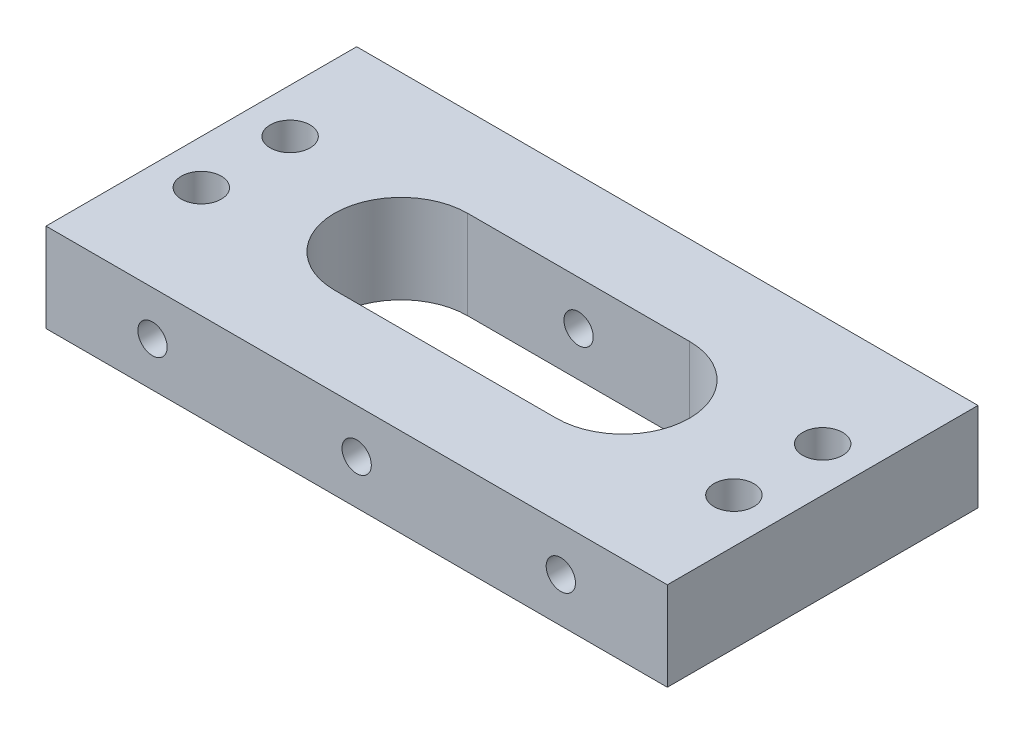
ISO-10303-21;
HEADER;
FILE_DESCRIPTION(('STEP AP214'),'2;1');
FILE_NAME('part.step','',(''),(''),'','','');
FILE_SCHEMA(('AUTOMOTIVE_DESIGN { 1 0 10303 214 1 1 1 1 }'));
ENDSEC;
DATA;
#1=APPLICATION_CONTEXT('core data for automotive mechanical design processes');
#2=APPLICATION_PROTOCOL_DEFINITION('international standard','automotive_design',2000,#1);
#3=PRODUCT_CONTEXT('',#1,'mechanical');
#4=PRODUCT('Part','Part','',(#3));
#5=PRODUCT_RELATED_PRODUCT_CATEGORY('part','',(#4));
#6=PRODUCT_DEFINITION_FORMATION('','',#4);
#7=PRODUCT_DEFINITION_CONTEXT('part definition',#1,'design');
#8=PRODUCT_DEFINITION('design','',#6,#7);
#9=PRODUCT_DEFINITION_SHAPE('','',#8);
#10=(LENGTH_UNIT() NAMED_UNIT(*) SI_UNIT(.MILLI.,.METRE.));
#11=(NAMED_UNIT(*) PLANE_ANGLE_UNIT() SI_UNIT($,.RADIAN.));
#12=(NAMED_UNIT(*) SI_UNIT($,.STERADIAN.) SOLID_ANGLE_UNIT());
#13=UNCERTAINTY_MEASURE_WITH_UNIT(LENGTH_MEASURE(1.E-05),#10,'distance_accuracy_value','');
#14=(GEOMETRIC_REPRESENTATION_CONTEXT(3) GLOBAL_UNCERTAINTY_ASSIGNED_CONTEXT((#13)) GLOBAL_UNIT_ASSIGNED_CONTEXT((#10,
#11,#12)) REPRESENTATION_CONTEXT('',''));
#15=CARTESIAN_POINT('',(0.,0.,0.));
#16=DIRECTION('',(0.,0.,1.));
#17=DIRECTION('',(1.,0.,0.));
#18=AXIS2_PLACEMENT_3D('',#15,#16,#17);
#19=CARTESIAN_POINT('',(35.,10.,-17.5));
#20=DIRECTION('',(0.,0.,1.));
#21=DIRECTION('',(1.,0.,0.));
#22=AXIS2_PLACEMENT_3D('',#19,#20,#21);
#23=PLANE('',#22);
#24=CARTESIAN_POINT('',(0.,5.,-17.5));
#25=DIRECTION('',(0.,0.,1.));
#26=DIRECTION('',(1.,0.,0.));
#27=AXIS2_PLACEMENT_3D('',#24,#25,#26);
#28=CIRCLE('',#27,1.65);
#29=CARTESIAN_POINT('',(1.65,5.,-17.5));
#30=VERTEX_POINT('',#29);
#31=EDGE_CURVE('E292',#30,#30,#28,.T.);
#32=ORIENTED_EDGE('',*,*,#31,.T.);
#33=EDGE_LOOP('',(#32));
#34=FACE_BOUND('',#33,.T.);
#35=DIRECTION('',(-1.,0.,0.));
#36=VECTOR('',#35,1.);
#37=CARTESIAN_POINT('',(35.,0.,-17.5));
#38=LINE('',#37,#36);
#39=CARTESIAN_POINT('',(35.,0.,-17.5));
#40=VERTEX_POINT('',#39);
#41=CARTESIAN_POINT('',(-35.,0.,-17.5));
#42=VERTEX_POINT('',#41);
#43=EDGE_CURVE('E161',#40,#42,#38,.T.);
#44=ORIENTED_EDGE('',*,*,#43,.T.);
#45=DIRECTION('',(0.,-1.,0.));
#46=VECTOR('',#45,1.);
#47=CARTESIAN_POINT('',(-35.,10.,-17.5));
#48=LINE('',#47,#46);
#49=CARTESIAN_POINT('',(-35.,10.,-17.5));
#50=VERTEX_POINT('',#49);
#51=EDGE_CURVE('E167',#50,#42,#48,.T.);
#52=ORIENTED_EDGE('',*,*,#51,.F.);
#53=DIRECTION('',(-1.,0.,0.));
#54=VECTOR('',#53,1.);
#55=CARTESIAN_POINT('',(35.,10.,-17.5));
#56=LINE('',#55,#54);
#57=CARTESIAN_POINT('',(35.,10.,-17.5));
#58=VERTEX_POINT('',#57);
#59=EDGE_CURVE('E165',#58,#50,#56,.T.);
#60=ORIENTED_EDGE('',*,*,#59,.F.);
#61=DIRECTION('',(0.,-1.,0.));
#62=VECTOR('',#61,1.);
#63=CARTESIAN_POINT('',(35.,10.,-17.5));
#64=LINE('',#63,#62);
#65=EDGE_CURVE('E177',#58,#40,#64,.T.);
#66=ORIENTED_EDGE('',*,*,#65,.T.);
#67=EDGE_LOOP('',(#44,#52,#60,#66));
#68=FACE_BOUND('',#67,.T.);
#69=CARTESIAN_POINT('',(-23.,5.,-17.5));
#70=DIRECTION('',(0.,0.,1.));
#71=DIRECTION('',(1.,0.,0.));
#72=AXIS2_PLACEMENT_3D('',#69,#70,#71);
#73=CIRCLE('',#72,1.65);
#74=CARTESIAN_POINT('',(-21.35,5.,-17.5));
#75=VERTEX_POINT('',#74);
#76=EDGE_CURVE('E301',#75,#75,#73,.T.);
#77=ORIENTED_EDGE('',*,*,#76,.T.);
#78=EDGE_LOOP('',(#77));
#79=FACE_BOUND('',#78,.T.);
#80=CARTESIAN_POINT('',(23.,5.,-17.5));
#81=DIRECTION('',(0.,0.,1.));
#82=DIRECTION('',(-1.,0.,0.));
#83=AXIS2_PLACEMENT_3D('',#80,#81,#82);
#84=CIRCLE('',#83,1.65);
#85=CARTESIAN_POINT('',(21.35,5.,-17.5));
#86=VERTEX_POINT('',#85);
#87=EDGE_CURVE('E293',#86,#86,#84,.T.);
#88=ORIENTED_EDGE('',*,*,#87,.T.);
#89=EDGE_LOOP('',(#88));
#90=FACE_BOUND('',#89,.T.);
#91=ADVANCED_FACE('F32',(#34,#68,#79,#90),#23,.F.);
#92=CARTESIAN_POINT('',(-12.5,0.,-7.5));
#93=DIRECTION('',(0.,0.,-1.));
#94=DIRECTION('',(-1.,0.,0.));
#95=AXIS2_PLACEMENT_3D('',#92,#93,#94);
#96=PLANE('',#95);
#97=DIRECTION('',(-1.,0.,0.));
#98=VECTOR('',#97,1.);
#99=CARTESIAN_POINT('',(-12.5,10.,-7.5));
#100=LINE('',#99,#98);
#101=CARTESIAN_POINT('',(12.5,10.,-7.5));
#102=VERTEX_POINT('',#101);
#103=CARTESIAN_POINT('',(-12.5,10.,-7.5));
#104=VERTEX_POINT('',#103);
#105=EDGE_CURVE('E116',#102,#104,#100,.T.);
#106=ORIENTED_EDGE('',*,*,#105,.T.);
#107=DIRECTION('',(0.,1.,0.));
#108=VECTOR('',#107,1.);
#109=CARTESIAN_POINT('',(-12.5,0.,-7.5));
#110=LINE('',#109,#108);
#111=CARTESIAN_POINT('',(-12.5,0.,-7.5));
#112=VERTEX_POINT('',#111);
#113=EDGE_CURVE('E133',#112,#104,#110,.T.);
#114=ORIENTED_EDGE('',*,*,#113,.F.);
#115=DIRECTION('',(-1.,0.,0.));
#116=VECTOR('',#115,1.);
#117=CARTESIAN_POINT('',(-12.5,0.,-7.5));
#118=LINE('',#117,#116);
#119=CARTESIAN_POINT('',(12.5,0.,-7.5));
#120=VERTEX_POINT('',#119);
#121=EDGE_CURVE('E105',#120,#112,#118,.T.);
#122=ORIENTED_EDGE('',*,*,#121,.F.);
#123=DIRECTION('',(0.,1.,0.));
#124=VECTOR('',#123,1.);
#125=CARTESIAN_POINT('',(12.5,0.,-7.5));
#126=LINE('',#125,#124);
#127=EDGE_CURVE('E136',#120,#102,#126,.T.);
#128=ORIENTED_EDGE('',*,*,#127,.T.);
#129=EDGE_LOOP('',(#106,#114,#122,#128));
#130=FACE_BOUND('',#129,.T.);
#131=CARTESIAN_POINT('',(0.,5.,-7.50000000000001));
#132=DIRECTION('',(0.,0.,1.));
#133=DIRECTION('',(1.,0.,0.));
#134=AXIS2_PLACEMENT_3D('',#131,#132,#133);
#135=CIRCLE('',#134,1.65);
#136=CARTESIAN_POINT('',(1.65,5.,-7.50000000000001));
#137=VERTEX_POINT('',#136);
#138=EDGE_CURVE('E295',#137,#137,#135,.T.);
#139=ORIENTED_EDGE('',*,*,#138,.F.);
#140=EDGE_LOOP('',(#139));
#141=FACE_BOUND('',#140,.T.);
#142=ADVANCED_FACE('F206',(#130,#141),#96,.F.);
#143=CARTESIAN_POINT('',(-35.,10.,17.5));
#144=DIRECTION('',(1.,0.,0.));
#145=DIRECTION('',(0.,0.,-1.));
#146=AXIS2_PLACEMENT_3D('',#143,#144,#145);
#147=PLANE('',#146);
#148=DIRECTION('',(0.,0.,1.));
#149=VECTOR('',#148,1.);
#150=CARTESIAN_POINT('',(-35.,0.,17.5));
#151=LINE('',#150,#149);
#152=CARTESIAN_POINT('',(-35.,0.,17.5));
#153=VERTEX_POINT('',#152);
#154=EDGE_CURVE('E154',#42,#153,#151,.T.);
#155=ORIENTED_EDGE('',*,*,#154,.T.);
#156=DIRECTION('',(0.,-1.,0.));
#157=VECTOR('',#156,1.);
#158=CARTESIAN_POINT('',(-35.,10.,17.5));
#159=LINE('',#158,#157);
#160=CARTESIAN_POINT('',(-35.,10.,17.5));
#161=VERTEX_POINT('',#160);
#162=EDGE_CURVE('E11',#161,#153,#159,.T.);
#163=ORIENTED_EDGE('',*,*,#162,.F.);
#164=DIRECTION('',(0.,0.,1.));
#165=VECTOR('',#164,1.);
#166=CARTESIAN_POINT('',(-35.,10.,17.5));
#167=LINE('',#166,#165);
#168=EDGE_CURVE('E157',#50,#161,#167,.T.);
#169=ORIENTED_EDGE('',*,*,#168,.F.);
#170=ORIENTED_EDGE('',*,*,#51,.T.);
#171=EDGE_LOOP('',(#155,#163,#169,#170));
#172=FACE_BOUND('',#171,.T.);
#173=ADVANCED_FACE('F34',(#172),#147,.F.);
#174=CARTESIAN_POINT('',(35.,10.,17.5));
#175=DIRECTION('',(0.,0.,-1.));
#176=DIRECTION('',(-1.,0.,0.));
#177=AXIS2_PLACEMENT_3D('',#174,#175,#176);
#178=PLANE('',#177);
#179=CARTESIAN_POINT('',(23.,5.,17.5));
#180=DIRECTION('',(0.,0.,1.));
#181=DIRECTION('',(-1.,0.,0.));
#182=AXIS2_PLACEMENT_3D('',#179,#180,#181);
#183=CIRCLE('',#182,1.65);
#184=CARTESIAN_POINT('',(21.35,5.,17.5));
#185=VERTEX_POINT('',#184);
#186=EDGE_CURVE('E141',#185,#185,#183,.T.);
#187=ORIENTED_EDGE('',*,*,#186,.F.);
#188=EDGE_LOOP('',(#187));
#189=FACE_BOUND('',#188,.T.);
#190=CARTESIAN_POINT('',(0.,5.,17.5));
#191=DIRECTION('',(0.,0.,1.));
#192=DIRECTION('',(1.,0.,0.));
#193=AXIS2_PLACEMENT_3D('',#190,#191,#192);
#194=CIRCLE('',#193,1.65);
#195=CARTESIAN_POINT('',(1.65,5.,17.5));
#196=VERTEX_POINT('',#195);
#197=EDGE_CURVE('E145',#196,#196,#194,.T.);
#198=ORIENTED_EDGE('',*,*,#197,.F.);
#199=EDGE_LOOP('',(#198));
#200=FACE_BOUND('',#199,.T.);
#201=CARTESIAN_POINT('',(-23.,5.,17.5));
#202=DIRECTION('',(0.,0.,1.));
#203=DIRECTION('',(1.,0.,0.));
#204=AXIS2_PLACEMENT_3D('',#201,#202,#203);
#205=CIRCLE('',#204,1.65);
#206=CARTESIAN_POINT('',(-21.35,5.,17.5));
#207=VERTEX_POINT('',#206);
#208=EDGE_CURVE('E150',#207,#207,#205,.T.);
#209=ORIENTED_EDGE('',*,*,#208,.F.);
#210=EDGE_LOOP('',(#209));
#211=FACE_BOUND('',#210,.T.);
#212=DIRECTION('',(1.,0.,0.));
#213=VECTOR('',#212,1.);
#214=CARTESIAN_POINT('',(35.,0.,17.5));
#215=LINE('',#214,#213);
#216=CARTESIAN_POINT('',(35.,0.,17.5));
#217=VERTEX_POINT('',#216);
#218=EDGE_CURVE('E170',#153,#217,#215,.T.);
#219=ORIENTED_EDGE('',*,*,#218,.T.);
#220=DIRECTION('',(0.,-1.,0.));
#221=VECTOR('',#220,1.);
#222=CARTESIAN_POINT('',(35.,10.,17.5));
#223=LINE('',#222,#221);
#224=CARTESIAN_POINT('',(35.,10.,17.5));
#225=VERTEX_POINT('',#224);
#226=EDGE_CURVE('E40',#225,#217,#223,.T.);
#227=ORIENTED_EDGE('',*,*,#226,.F.);
#228=DIRECTION('',(1.,0.,0.));
#229=VECTOR('',#228,1.);
#230=CARTESIAN_POINT('',(35.,10.,17.5));
#231=LINE('',#230,#229);
#232=EDGE_CURVE('E160',#161,#225,#231,.T.);
#233=ORIENTED_EDGE('',*,*,#232,.F.);
#234=ORIENTED_EDGE('',*,*,#162,.T.);
#235=EDGE_LOOP('',(#219,#227,#233,#234));
#236=FACE_BOUND('',#235,.T.);
#237=ADVANCED_FACE('F198',(#189,#200,#211,#236),#178,.F.);
#238=CARTESIAN_POINT('',(35.,10.,17.5));
#239=DIRECTION('',(-1.,0.,0.));
#240=DIRECTION('',(0.,0.,1.));
#241=AXIS2_PLACEMENT_3D('',#238,#239,#240);
#242=PLANE('',#241);
#243=DIRECTION('',(0.,0.,-1.));
#244=VECTOR('',#243,1.);
#245=CARTESIAN_POINT('',(35.,0.,17.5));
#246=LINE('',#245,#244);
#247=EDGE_CURVE('E172',#217,#40,#246,.T.);
#248=ORIENTED_EDGE('',*,*,#247,.T.);
#249=ORIENTED_EDGE('',*,*,#65,.F.);
#250=DIRECTION('',(0.,0.,-1.));
#251=VECTOR('',#250,1.);
#252=CARTESIAN_POINT('',(35.,10.,17.5));
#253=LINE('',#252,#251);
#254=EDGE_CURVE('E163',#225,#58,#253,.T.);
#255=ORIENTED_EDGE('',*,*,#254,.F.);
#256=ORIENTED_EDGE('',*,*,#226,.T.);
#257=EDGE_LOOP('',(#248,#249,#255,#256));
#258=FACE_BOUND('',#257,.T.);
#259=ADVANCED_FACE('F184',(#258),#242,.F.);
#260=CARTESIAN_POINT('',(-35.,10.,-17.5));
#261=DIRECTION('',(0.,1.,0.));
#262=DIRECTION('',(0.,0.,1.));
#263=AXIS2_PLACEMENT_3D('',#260,#261,#262);
#264=PLANE('',#263);
#265=CARTESIAN_POINT('',(30.,10.,-5.));
#266=DIRECTION('',(0.,1.,0.));
#267=DIRECTION('',(0.,0.,1.));
#268=AXIS2_PLACEMENT_3D('',#265,#266,#267);
#269=CIRCLE('',#268,2.25);
#270=CARTESIAN_POINT('',(30.,10.,-2.75));
#271=VERTEX_POINT('',#270);
#272=EDGE_CURVE('E306',#271,#271,#269,.T.);
#273=ORIENTED_EDGE('',*,*,#272,.F.);
#274=EDGE_LOOP('',(#273));
#275=FACE_BOUND('',#274,.T.);
#276=CARTESIAN_POINT('',(30.,10.,5.));
#277=DIRECTION('',(0.,1.,0.));
#278=DIRECTION('',(0.,0.,-1.));
#279=AXIS2_PLACEMENT_3D('',#276,#277,#278);
#280=CIRCLE('',#279,2.25);
#281=CARTESIAN_POINT('',(30.,10.,2.75));
#282=VERTEX_POINT('',#281);
#283=EDGE_CURVE('E312',#282,#282,#280,.T.);
#284=ORIENTED_EDGE('',*,*,#283,.F.);
#285=EDGE_LOOP('',(#284));
#286=FACE_BOUND('',#285,.T.);
#287=CARTESIAN_POINT('',(-30.,10.,-5.));
#288=DIRECTION('',(0.,1.,0.));
#289=DIRECTION('',(0.,0.,-1.));
#290=AXIS2_PLACEMENT_3D('',#287,#288,#289);
#291=CIRCLE('',#290,2.25);
#292=CARTESIAN_POINT('',(-30.,10.,-7.25));
#293=VERTEX_POINT('',#292);
#294=EDGE_CURVE('E318',#293,#293,#291,.T.);
#295=ORIENTED_EDGE('',*,*,#294,.F.);
#296=EDGE_LOOP('',(#295));
#297=FACE_BOUND('',#296,.T.);
#298=CARTESIAN_POINT('',(-30.,10.,5.));
#299=DIRECTION('',(0.,1.,0.));
#300=DIRECTION('',(0.,0.,1.));
#301=AXIS2_PLACEMENT_3D('',#298,#299,#300);
#302=CIRCLE('',#301,2.25);
#303=CARTESIAN_POINT('',(-30.,10.,7.25));
#304=VERTEX_POINT('',#303);
#305=EDGE_CURVE('E122',#304,#304,#302,.T.);
#306=ORIENTED_EDGE('',*,*,#305,.F.);
#307=EDGE_LOOP('',(#306));
#308=FACE_BOUND('',#307,.T.);
#309=CARTESIAN_POINT('',(-12.5,10.,0.));
#310=DIRECTION('',(0.,1.,0.));
#311=DIRECTION('',(0.,0.,1.));
#312=AXIS2_PLACEMENT_3D('',#309,#310,#311);
#313=CIRCLE('',#312,7.5);
#314=CARTESIAN_POINT('',(-12.5,10.,7.5));
#315=VERTEX_POINT('',#314);
#316=EDGE_CURVE('E47',#104,#315,#313,.T.);
#317=ORIENTED_EDGE('',*,*,#316,.F.);
#318=ORIENTED_EDGE('',*,*,#105,.F.);
#319=CARTESIAN_POINT('',(12.5,10.,0.));
#320=DIRECTION('',(0.,1.,0.));
#321=DIRECTION('',(0.,0.,1.));
#322=AXIS2_PLACEMENT_3D('',#319,#320,#321);
#323=CIRCLE('',#322,7.5);
#324=CARTESIAN_POINT('',(12.5,10.,7.5));
#325=VERTEX_POINT('',#324);
#326=EDGE_CURVE('E119',#325,#102,#323,.T.);
#327=ORIENTED_EDGE('',*,*,#326,.F.);
#328=DIRECTION('',(1.,0.,0.));
#329=VECTOR('',#328,1.);
#330=CARTESIAN_POINT('',(-12.5,10.,7.5));
#331=LINE('',#330,#329);
#332=EDGE_CURVE('E128',#315,#325,#331,.T.);
#333=ORIENTED_EDGE('',*,*,#332,.F.);
#334=EDGE_LOOP('',(#317,#318,#327,#333));
#335=FACE_BOUND('',#334,.T.);
#336=ORIENTED_EDGE('',*,*,#168,.T.);
#337=ORIENTED_EDGE('',*,*,#232,.T.);
#338=ORIENTED_EDGE('',*,*,#254,.T.);
#339=ORIENTED_EDGE('',*,*,#59,.T.);
#340=EDGE_LOOP('',(#336,#337,#338,#339));
#341=FACE_BOUND('',#340,.T.);
#342=ADVANCED_FACE('F197',(#275,#286,#297,#308,#335,#341),#264,.T.);
#343=CARTESIAN_POINT('',(-35.,0.,-17.5));
#344=DIRECTION('',(0.,1.,0.));
#345=DIRECTION('',(0.,0.,1.));
#346=AXIS2_PLACEMENT_3D('',#343,#344,#345);
#347=PLANE('',#346);
#348=CARTESIAN_POINT('',(30.,0.,-5.));
#349=DIRECTION('',(0.,1.,0.));
#350=DIRECTION('',(0.,0.,1.));
#351=AXIS2_PLACEMENT_3D('',#348,#349,#350);
#352=CIRCLE('',#351,2.25);
#353=CARTESIAN_POINT('',(30.,0.,-2.75));
#354=VERTEX_POINT('',#353);
#355=EDGE_CURVE('E309',#354,#354,#352,.T.);
#356=ORIENTED_EDGE('',*,*,#355,.T.);
#357=EDGE_LOOP('',(#356));
#358=FACE_BOUND('',#357,.T.);
#359=CARTESIAN_POINT('',(30.,0.,5.));
#360=DIRECTION('',(0.,1.,0.));
#361=DIRECTION('',(0.,0.,-1.));
#362=AXIS2_PLACEMENT_3D('',#359,#360,#361);
#363=CIRCLE('',#362,2.25);
#364=CARTESIAN_POINT('',(30.,0.,2.75));
#365=VERTEX_POINT('',#364);
#366=EDGE_CURVE('E315',#365,#365,#363,.T.);
#367=ORIENTED_EDGE('',*,*,#366,.T.);
#368=EDGE_LOOP('',(#367));
#369=FACE_BOUND('',#368,.T.);
#370=CARTESIAN_POINT('',(-30.,0.,-5.));
#371=DIRECTION('',(0.,1.,0.));
#372=DIRECTION('',(0.,0.,-1.));
#373=AXIS2_PLACEMENT_3D('',#370,#371,#372);
#374=CIRCLE('',#373,2.25);
#375=CARTESIAN_POINT('',(-30.,0.,-7.25));
#376=VERTEX_POINT('',#375);
#377=EDGE_CURVE('E321',#376,#376,#374,.T.);
#378=ORIENTED_EDGE('',*,*,#377,.T.);
#379=EDGE_LOOP('',(#378));
#380=FACE_BOUND('',#379,.T.);
#381=CARTESIAN_POINT('',(-30.,0.,5.));
#382=DIRECTION('',(0.,1.,0.));
#383=DIRECTION('',(0.,0.,1.));
#384=AXIS2_PLACEMENT_3D('',#381,#382,#383);
#385=CIRCLE('',#384,2.25);
#386=CARTESIAN_POINT('',(-30.,0.,7.25));
#387=VERTEX_POINT('',#386);
#388=EDGE_CURVE('E129',#387,#387,#385,.T.);
#389=ORIENTED_EDGE('',*,*,#388,.T.);
#390=EDGE_LOOP('',(#389));
#391=FACE_BOUND('',#390,.T.);
#392=ORIENTED_EDGE('',*,*,#121,.T.);
#393=CARTESIAN_POINT('',(-12.5,0.,0.));
#394=DIRECTION('',(0.,1.,0.));
#395=DIRECTION('',(0.,0.,1.));
#396=AXIS2_PLACEMENT_3D('',#393,#394,#395);
#397=CIRCLE('',#396,7.5);
#398=CARTESIAN_POINT('',(-12.5,0.,7.5));
#399=VERTEX_POINT('',#398);
#400=EDGE_CURVE('E99',#112,#399,#397,.T.);
#401=ORIENTED_EDGE('',*,*,#400,.T.);
#402=DIRECTION('',(1.,0.,0.));
#403=VECTOR('',#402,1.);
#404=CARTESIAN_POINT('',(-12.5,0.,7.5));
#405=LINE('',#404,#403);
#406=CARTESIAN_POINT('',(12.5,0.,7.5));
#407=VERTEX_POINT('',#406);
#408=EDGE_CURVE('E108',#399,#407,#405,.T.);
#409=ORIENTED_EDGE('',*,*,#408,.T.);
#410=CARTESIAN_POINT('',(12.5,0.,0.));
#411=DIRECTION('',(0.,1.,0.));
#412=DIRECTION('',(0.,0.,1.));
#413=AXIS2_PLACEMENT_3D('',#410,#411,#412);
#414=CIRCLE('',#413,7.5);
#415=EDGE_CURVE('E55',#407,#120,#414,.T.);
#416=ORIENTED_EDGE('',*,*,#415,.T.);
#417=EDGE_LOOP('',(#392,#401,#409,#416));
#418=FACE_BOUND('',#417,.T.);
#419=ORIENTED_EDGE('',*,*,#154,.F.);
#420=ORIENTED_EDGE('',*,*,#43,.F.);
#421=ORIENTED_EDGE('',*,*,#247,.F.);
#422=ORIENTED_EDGE('',*,*,#218,.F.);
#423=EDGE_LOOP('',(#419,#420,#421,#422));
#424=FACE_BOUND('',#423,.T.);
#425=ADVANCED_FACE('F113',(#358,#369,#380,#391,#418,#424),#347,.F.);
#426=CARTESIAN_POINT('',(-23.,5.,7.50000000000001));
#427=DIRECTION('',(0.,0.,1.));
#428=DIRECTION('',(1.,0.,0.));
#429=AXIS2_PLACEMENT_3D('',#426,#427,#428);
#430=CYLINDRICAL_SURFACE('',#429,1.65);
#431=CARTESIAN_POINT('',(-23.,5.,7.50000000000001));
#432=DIRECTION('',(0.,0.,1.));
#433=DIRECTION('',(1.,0.,0.));
#434=AXIS2_PLACEMENT_3D('',#431,#432,#433);
#435=CIRCLE('',#434,1.65);
#436=CARTESIAN_POINT('',(-21.35,5.,7.50000000000001));
#437=VERTEX_POINT('',#436);
#438=EDGE_CURVE('E151',#437,#437,#435,.T.);
#439=ORIENTED_EDGE('',*,*,#438,.F.);
#440=EDGE_LOOP('',(#439));
#441=FACE_BOUND('',#440,.T.);
#442=ORIENTED_EDGE('',*,*,#208,.T.);
#443=EDGE_LOOP('',(#442));
#444=FACE_BOUND('',#443,.T.);
#445=ADVANCED_FACE('F221',(#441,#444),#430,.F.);
#446=CARTESIAN_POINT('',(-23.,5.,7.50000000000001));
#447=DIRECTION('',(0.,0.,1.));
#448=DIRECTION('',(1.,0.,0.));
#449=AXIS2_PLACEMENT_3D('',#446,#447,#448);
#450=PLANE('',#449);
#451=ORIENTED_EDGE('',*,*,#438,.T.);
#452=EDGE_LOOP('',(#451));
#453=FACE_BOUND('',#452,.T.);
#454=ADVANCED_FACE('F228',(#453),#450,.T.);
#455=CARTESIAN_POINT('',(0.,5.,7.50000000000001));
#456=DIRECTION('',(0.,0.,1.));
#457=DIRECTION('',(1.,0.,0.));
#458=AXIS2_PLACEMENT_3D('',#455,#456,#457);
#459=CYLINDRICAL_SURFACE('',#458,1.65);
#460=CARTESIAN_POINT('',(0.,5.,7.5));
#461=DIRECTION('',(0.,0.,1.));
#462=DIRECTION('',(1.,0.,0.));
#463=AXIS2_PLACEMENT_3D('',#460,#461,#462);
#464=CIRCLE('',#463,1.65);
#465=CARTESIAN_POINT('',(1.65,5.,7.5));
#466=VERTEX_POINT('',#465);
#467=EDGE_CURVE('E135',#466,#466,#464,.F.);
#468=ORIENTED_EDGE('',*,*,#467,.T.);
#469=EDGE_LOOP('',(#468));
#470=FACE_BOUND('',#469,.T.);
#471=ORIENTED_EDGE('',*,*,#197,.T.);
#472=EDGE_LOOP('',(#471));
#473=FACE_BOUND('',#472,.T.);
#474=ADVANCED_FACE('F232',(#470,#473),#459,.F.);
#475=CARTESIAN_POINT('',(23.,5.,7.50000000000001));
#476=DIRECTION('',(0.,0.,1.));
#477=DIRECTION('',(1.,0.,0.));
#478=AXIS2_PLACEMENT_3D('',#475,#476,#477);
#479=CYLINDRICAL_SURFACE('',#478,1.65);
#480=CARTESIAN_POINT('',(23.,5.,7.50000000000001));
#481=DIRECTION('',(0.,0.,1.));
#482=DIRECTION('',(-1.,0.,0.));
#483=AXIS2_PLACEMENT_3D('',#480,#481,#482);
#484=CIRCLE('',#483,1.65);
#485=CARTESIAN_POINT('',(21.35,5.,7.50000000000001));
#486=VERTEX_POINT('',#485);
#487=EDGE_CURVE('E142',#486,#486,#484,.T.);
#488=ORIENTED_EDGE('',*,*,#487,.F.);
#489=EDGE_LOOP('',(#488));
#490=FACE_BOUND('',#489,.T.);
#491=ORIENTED_EDGE('',*,*,#186,.T.);
#492=EDGE_LOOP('',(#491));
#493=FACE_BOUND('',#492,.T.);
#494=ADVANCED_FACE('F236',(#490,#493),#479,.F.);
#495=CARTESIAN_POINT('',(23.,5.,7.50000000000001));
#496=DIRECTION('',(0.,0.,-1.));
#497=DIRECTION('',(-1.,0.,0.));
#498=AXIS2_PLACEMENT_3D('',#495,#496,#497);
#499=PLANE('',#498);
#500=ORIENTED_EDGE('',*,*,#487,.T.);
#501=EDGE_LOOP('',(#500));
#502=FACE_BOUND('',#501,.T.);
#503=ADVANCED_FACE('F240',(#502),#499,.F.);
#504=CARTESIAN_POINT('',(-12.5,0.,7.5));
#505=DIRECTION('',(0.,0.,1.));
#506=DIRECTION('',(1.,0.,0.));
#507=AXIS2_PLACEMENT_3D('',#504,#505,#506);
#508=PLANE('',#507);
#509=ORIENTED_EDGE('',*,*,#332,.T.);
#510=DIRECTION('',(0.,1.,0.));
#511=VECTOR('',#510,1.);
#512=CARTESIAN_POINT('',(12.5,0.,7.5));
#513=LINE('',#512,#511);
#514=EDGE_CURVE('E104',#407,#325,#513,.T.);
#515=ORIENTED_EDGE('',*,*,#514,.F.);
#516=ORIENTED_EDGE('',*,*,#408,.F.);
#517=DIRECTION('',(0.,1.,0.));
#518=VECTOR('',#517,1.);
#519=CARTESIAN_POINT('',(-12.5,0.,7.5));
#520=LINE('',#519,#518);
#521=EDGE_CURVE('E95',#399,#315,#520,.T.);
#522=ORIENTED_EDGE('',*,*,#521,.T.);
#523=EDGE_LOOP('',(#509,#515,#516,#522));
#524=FACE_BOUND('',#523,.T.);
#525=ORIENTED_EDGE('',*,*,#467,.F.);
#526=EDGE_LOOP('',(#525));
#527=FACE_BOUND('',#526,.T.);
#528=ADVANCED_FACE('F109',(#524,#527),#508,.F.);
#529=CARTESIAN_POINT('',(-12.5,0.,0.));
#530=DIRECTION('',(0.,1.,0.));
#531=DIRECTION('',(0.,0.,1.));
#532=AXIS2_PLACEMENT_3D('',#529,#530,#531);
#533=CYLINDRICAL_SURFACE('',#532,7.5);
#534=ORIENTED_EDGE('',*,*,#316,.T.);
#535=ORIENTED_EDGE('',*,*,#521,.F.);
#536=ORIENTED_EDGE('',*,*,#400,.F.);
#537=ORIENTED_EDGE('',*,*,#113,.T.);
#538=EDGE_LOOP('',(#534,#535,#536,#537));
#539=FACE_BOUND('',#538,.T.);
#540=ADVANCED_FACE('F97',(#539),#533,.F.);
#541=CARTESIAN_POINT('',(12.5,0.,0.));
#542=DIRECTION('',(0.,1.,0.));
#543=DIRECTION('',(0.,0.,1.));
#544=AXIS2_PLACEMENT_3D('',#541,#542,#543);
#545=CYLINDRICAL_SURFACE('',#544,7.5);
#546=ORIENTED_EDGE('',*,*,#326,.T.);
#547=ORIENTED_EDGE('',*,*,#127,.F.);
#548=ORIENTED_EDGE('',*,*,#415,.F.);
#549=ORIENTED_EDGE('',*,*,#514,.T.);
#550=EDGE_LOOP('',(#546,#547,#548,#549));
#551=FACE_BOUND('',#550,.T.);
#552=ADVANCED_FACE('F247',(#551),#545,.F.);
#553=CARTESIAN_POINT('',(-30.,0.,5.));
#554=DIRECTION('',(0.,1.,0.));
#555=DIRECTION('',(0.,0.,1.));
#556=AXIS2_PLACEMENT_3D('',#553,#554,#555);
#557=CYLINDRICAL_SURFACE('',#556,2.25);
#558=ORIENTED_EDGE('',*,*,#388,.F.);
#559=EDGE_LOOP('',(#558));
#560=FACE_BOUND('',#559,.T.);
#561=ORIENTED_EDGE('',*,*,#305,.T.);
#562=EDGE_LOOP('',(#561));
#563=FACE_BOUND('',#562,.T.);
#564=ADVANCED_FACE('F251',(#560,#563),#557,.F.);
#565=CARTESIAN_POINT('',(-30.,0.,-5.));
#566=DIRECTION('',(0.,1.,0.));
#567=DIRECTION('',(0.,0.,1.));
#568=AXIS2_PLACEMENT_3D('',#565,#566,#567);
#569=CYLINDRICAL_SURFACE('',#568,2.25);
#570=ORIENTED_EDGE('',*,*,#377,.F.);
#571=EDGE_LOOP('',(#570));
#572=FACE_BOUND('',#571,.T.);
#573=ORIENTED_EDGE('',*,*,#294,.T.);
#574=EDGE_LOOP('',(#573));
#575=FACE_BOUND('',#574,.T.);
#576=ADVANCED_FACE('F255',(#572,#575),#569,.F.);
#577=CARTESIAN_POINT('',(30.,0.,5.));
#578=DIRECTION('',(0.,1.,0.));
#579=DIRECTION('',(0.,0.,1.));
#580=AXIS2_PLACEMENT_3D('',#577,#578,#579);
#581=CYLINDRICAL_SURFACE('',#580,2.25);
#582=ORIENTED_EDGE('',*,*,#366,.F.);
#583=EDGE_LOOP('',(#582));
#584=FACE_BOUND('',#583,.T.);
#585=ORIENTED_EDGE('',*,*,#283,.T.);
#586=EDGE_LOOP('',(#585));
#587=FACE_BOUND('',#586,.T.);
#588=ADVANCED_FACE('F259',(#584,#587),#581,.F.);
#589=CARTESIAN_POINT('',(30.,0.,-5.));
#590=DIRECTION('',(0.,1.,0.));
#591=DIRECTION('',(0.,0.,1.));
#592=AXIS2_PLACEMENT_3D('',#589,#590,#591);
#593=CYLINDRICAL_SURFACE('',#592,2.25);
#594=ORIENTED_EDGE('',*,*,#355,.F.);
#595=EDGE_LOOP('',(#594));
#596=FACE_BOUND('',#595,.T.);
#597=ORIENTED_EDGE('',*,*,#272,.T.);
#598=EDGE_LOOP('',(#597));
#599=FACE_BOUND('',#598,.T.);
#600=ADVANCED_FACE('F263',(#596,#599),#593,.F.);
#601=CARTESIAN_POINT('',(-23.,5.,-7.50000000000001));
#602=DIRECTION('',(0.,0.,-1.));
#603=DIRECTION('',(-1.,0.,0.));
#604=AXIS2_PLACEMENT_3D('',#601,#602,#603);
#605=CYLINDRICAL_SURFACE('',#604,1.65);
#606=CARTESIAN_POINT('',(-23.,5.,-7.50000000000001));
#607=DIRECTION('',(0.,0.,1.));
#608=DIRECTION('',(1.,0.,0.));
#609=AXIS2_PLACEMENT_3D('',#606,#607,#608);
#610=CIRCLE('',#609,1.65);
#611=CARTESIAN_POINT('',(-21.35,5.,-7.50000000000001));
#612=VERTEX_POINT('',#611);
#613=EDGE_CURVE('E303',#612,#612,#610,.T.);
#614=ORIENTED_EDGE('',*,*,#613,.T.);
#615=EDGE_LOOP('',(#614));
#616=FACE_BOUND('',#615,.T.);
#617=ORIENTED_EDGE('',*,*,#76,.F.);
#618=EDGE_LOOP('',(#617));
#619=FACE_BOUND('',#618,.T.);
#620=ADVANCED_FACE('F267',(#616,#619),#605,.F.);
#621=CARTESIAN_POINT('',(-23.,5.,-7.50000000000001));
#622=DIRECTION('',(0.,0.,-1.));
#623=DIRECTION('',(1.,0.,0.));
#624=AXIS2_PLACEMENT_3D('',#621,#622,#623);
#625=PLANE('',#624);
#626=ORIENTED_EDGE('',*,*,#613,.F.);
#627=EDGE_LOOP('',(#626));
#628=FACE_BOUND('',#627,.T.);
#629=ADVANCED_FACE('F271',(#628),#625,.T.);
#630=CARTESIAN_POINT('',(0.,5.,-7.50000000000001));
#631=DIRECTION('',(0.,0.,-1.));
#632=DIRECTION('',(-1.,0.,0.));
#633=AXIS2_PLACEMENT_3D('',#630,#631,#632);
#634=CYLINDRICAL_SURFACE('',#633,1.65);
#635=ORIENTED_EDGE('',*,*,#138,.T.);
#636=EDGE_LOOP('',(#635));
#637=FACE_BOUND('',#636,.T.);
#638=ORIENTED_EDGE('',*,*,#31,.F.);
#639=EDGE_LOOP('',(#638));
#640=FACE_BOUND('',#639,.T.);
#641=ADVANCED_FACE('F275',(#637,#640),#634,.F.);
#642=CARTESIAN_POINT('',(23.,5.,-7.50000000000001));
#643=DIRECTION('',(0.,0.,-1.));
#644=DIRECTION('',(-1.,0.,0.));
#645=AXIS2_PLACEMENT_3D('',#642,#643,#644);
#646=CYLINDRICAL_SURFACE('',#645,1.65);
#647=CARTESIAN_POINT('',(23.,5.,-7.50000000000001));
#648=DIRECTION('',(0.,0.,1.));
#649=DIRECTION('',(-1.,0.,0.));
#650=AXIS2_PLACEMENT_3D('',#647,#648,#649);
#651=CIRCLE('',#650,1.65);
#652=CARTESIAN_POINT('',(21.35,5.,-7.50000000000001));
#653=VERTEX_POINT('',#652);
#654=EDGE_CURVE('E291',#653,#653,#651,.T.);
#655=ORIENTED_EDGE('',*,*,#654,.T.);
#656=EDGE_LOOP('',(#655));
#657=FACE_BOUND('',#656,.T.);
#658=ORIENTED_EDGE('',*,*,#87,.F.);
#659=EDGE_LOOP('',(#658));
#660=FACE_BOUND('',#659,.T.);
#661=ADVANCED_FACE('F279',(#657,#660),#646,.F.);
#662=CARTESIAN_POINT('',(23.,5.,-7.50000000000001));
#663=DIRECTION('',(0.,0.,1.));
#664=DIRECTION('',(-1.,0.,0.));
#665=AXIS2_PLACEMENT_3D('',#662,#663,#664);
#666=PLANE('',#665);
#667=ORIENTED_EDGE('',*,*,#654,.F.);
#668=EDGE_LOOP('',(#667));
#669=FACE_BOUND('',#668,.T.);
#670=ADVANCED_FACE('F283',(#669),#666,.F.);
#671=CLOSED_SHELL('',(#91,#142,#173,#237,#259,#342,#425,#445,#454,#474,#494,#503,#528,#540,#552,
#564,#576,#588,#600,#620,#629,#641,#661,#670));
#672=MANIFOLD_SOLID_BREP('B2',#671);
#673=ADVANCED_BREP_SHAPE_REPRESENTATION('',(#18,#672),#14);
#674=SHAPE_DEFINITION_REPRESENTATION(#9,#673);
ENDSEC;
END-ISO-10303-21;
